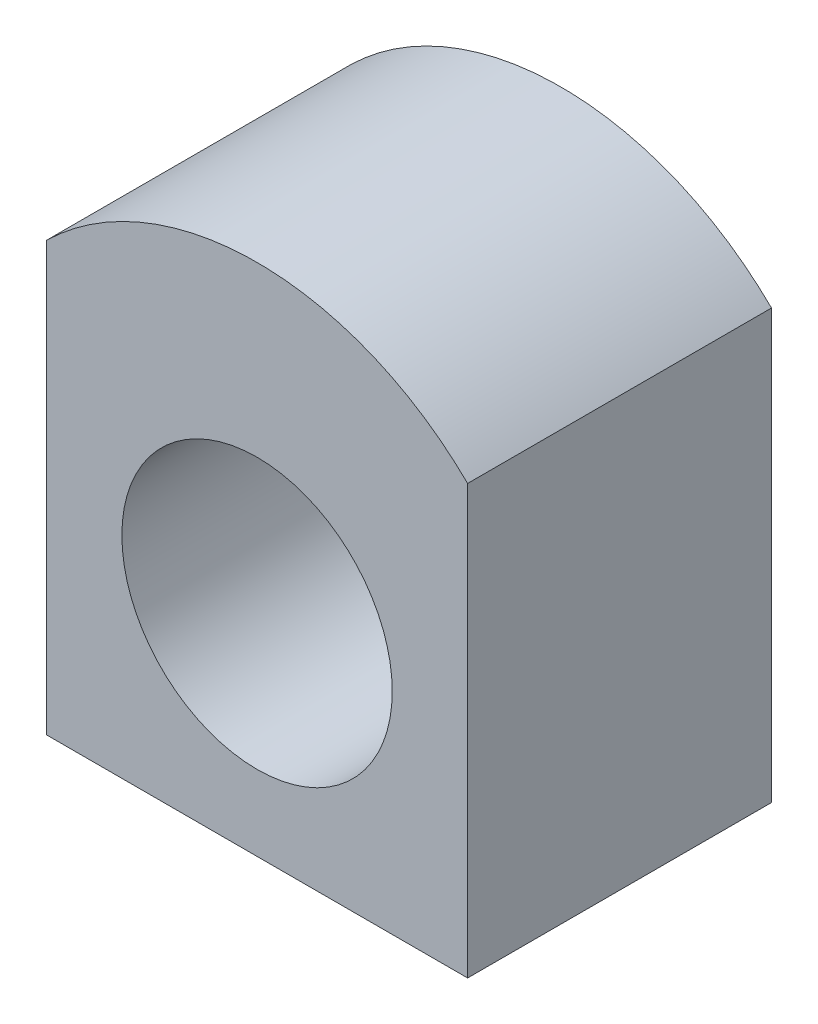
ISO-10303-21;
HEADER;
FILE_DESCRIPTION(('STEP AP214'),'2;1');
FILE_NAME('part.step','',(''),(''),'','','');
FILE_SCHEMA(('AUTOMOTIVE_DESIGN { 1 0 10303 214 1 1 1 1 }'));
ENDSEC;
DATA;
#1=APPLICATION_CONTEXT('core data for automotive mechanical design processes');
#2=APPLICATION_PROTOCOL_DEFINITION('international standard','automotive_design',2000,#1);
#3=PRODUCT_CONTEXT('',#1,'mechanical');
#4=PRODUCT('Part','Part','',(#3));
#5=PRODUCT_RELATED_PRODUCT_CATEGORY('part','',(#4));
#6=PRODUCT_DEFINITION_FORMATION('','',#4);
#7=PRODUCT_DEFINITION_CONTEXT('part definition',#1,'design');
#8=PRODUCT_DEFINITION('design','',#6,#7);
#9=PRODUCT_DEFINITION_SHAPE('','',#8);
#10=(LENGTH_UNIT() NAMED_UNIT(*) SI_UNIT(.MILLI.,.METRE.));
#11=(NAMED_UNIT(*) PLANE_ANGLE_UNIT() SI_UNIT($,.RADIAN.));
#12=(NAMED_UNIT(*) SI_UNIT($,.STERADIAN.) SOLID_ANGLE_UNIT());
#13=UNCERTAINTY_MEASURE_WITH_UNIT(LENGTH_MEASURE(1.E-05),#10,'distance_accuracy_value','');
#14=(GEOMETRIC_REPRESENTATION_CONTEXT(3) GLOBAL_UNCERTAINTY_ASSIGNED_CONTEXT((#13)) GLOBAL_UNIT_ASSIGNED_CONTEXT((#10,
#11,#12)) REPRESENTATION_CONTEXT('',''));
#15=CARTESIAN_POINT('',(0.,0.,0.));
#16=DIRECTION('',(0.,0.,1.));
#17=DIRECTION('',(1.,0.,0.));
#18=AXIS2_PLACEMENT_3D('',#15,#16,#17);
#19=CARTESIAN_POINT('',(-8.8,0.,12.7));
#20=DIRECTION('',(1.,0.,0.));
#21=DIRECTION('',(0.,0.,-1.));
#22=AXIS2_PLACEMENT_3D('',#19,#20,#21);
#23=PLANE('',#22);
#24=DIRECTION('',(0.,-1.,0.));
#25=VECTOR('',#24,1.);
#26=CARTESIAN_POINT('',(-8.8,0.,0.));
#27=LINE('',#26,#25);
#28=CARTESIAN_POINT('',(-8.8,17.9,0.));
#29=VERTEX_POINT('',#28);
#30=CARTESIAN_POINT('',(-8.8,0.,0.));
#31=VERTEX_POINT('',#30);
#32=EDGE_CURVE('E97',#29,#31,#27,.T.);
#33=ORIENTED_EDGE('',*,*,#32,.T.);
#34=DIRECTION('',(0.,0.,-1.));
#35=VECTOR('',#34,1.);
#36=CARTESIAN_POINT('',(-8.8,0.,12.7));
#37=LINE('',#36,#35);
#38=CARTESIAN_POINT('',(-8.8,0.,12.7));
#39=VERTEX_POINT('',#38);
#40=EDGE_CURVE('E11',#39,#31,#37,.T.);
#41=ORIENTED_EDGE('',*,*,#40,.F.);
#42=DIRECTION('',(0.,-1.,0.));
#43=VECTOR('',#42,1.);
#44=CARTESIAN_POINT('',(-8.8,0.,12.7));
#45=LINE('',#44,#43);
#46=CARTESIAN_POINT('',(-8.8,17.9,12.7));
#47=VERTEX_POINT('',#46);
#48=EDGE_CURVE('E85',#47,#39,#45,.T.);
#49=ORIENTED_EDGE('',*,*,#48,.F.);
#50=DIRECTION('',(0.,0.,-1.));
#51=VECTOR('',#50,1.);
#52=CARTESIAN_POINT('',(-8.8,17.9,12.7));
#53=LINE('',#52,#51);
#54=EDGE_CURVE('E93',#47,#29,#53,.T.);
#55=ORIENTED_EDGE('',*,*,#54,.T.);
#56=EDGE_LOOP('',(#33,#41,#49,#55));
#57=FACE_BOUND('',#56,.T.);
#58=ADVANCED_FACE('F34',(#57),#23,.F.);
#59=CARTESIAN_POINT('',(-8.8,0.,12.7));
#60=DIRECTION('',(0.,1.,0.));
#61=DIRECTION('',(0.,0.,1.));
#62=AXIS2_PLACEMENT_3D('',#59,#60,#61);
#63=PLANE('',#62);
#64=DIRECTION('',(1.,0.,0.));
#65=VECTOR('',#64,1.);
#66=CARTESIAN_POINT('',(-8.8,0.,0.));
#67=LINE('',#66,#65);
#68=CARTESIAN_POINT('',(8.8,0.,0.));
#69=VERTEX_POINT('',#68);
#70=EDGE_CURVE('E89',#31,#69,#67,.T.);
#71=ORIENTED_EDGE('',*,*,#70,.T.);
#72=DIRECTION('',(0.,0.,-1.));
#73=VECTOR('',#72,1.);
#74=CARTESIAN_POINT('',(8.8,0.,12.7));
#75=LINE('',#74,#73);
#76=CARTESIAN_POINT('',(8.8,0.,12.7));
#77=VERTEX_POINT('',#76);
#78=EDGE_CURVE('E42',#77,#69,#75,.T.);
#79=ORIENTED_EDGE('',*,*,#78,.F.);
#80=DIRECTION('',(1.,0.,0.));
#81=VECTOR('',#80,1.);
#82=CARTESIAN_POINT('',(-8.8,0.,12.7));
#83=LINE('',#82,#81);
#84=EDGE_CURVE('E80',#39,#77,#83,.T.);
#85=ORIENTED_EDGE('',*,*,#84,.F.);
#86=ORIENTED_EDGE('',*,*,#40,.T.);
#87=EDGE_LOOP('',(#71,#79,#85,#86));
#88=FACE_BOUND('',#87,.T.);
#89=ADVANCED_FACE('F88',(#88),#63,.F.);
#90=CARTESIAN_POINT('',(8.8,0.,12.7));
#91=DIRECTION('',(-1.,0.,0.));
#92=DIRECTION('',(0.,0.,1.));
#93=AXIS2_PLACEMENT_3D('',#90,#91,#92);
#94=PLANE('',#93);
#95=DIRECTION('',(0.,1.,0.));
#96=VECTOR('',#95,1.);
#97=CARTESIAN_POINT('',(8.8,0.,0.));
#98=LINE('',#97,#96);
#99=CARTESIAN_POINT('',(8.8,17.9,0.));
#100=VERTEX_POINT('',#99);
#101=EDGE_CURVE('E67',#69,#100,#98,.T.);
#102=ORIENTED_EDGE('',*,*,#101,.T.);
#103=DIRECTION('',(0.,0.,-1.));
#104=VECTOR('',#103,1.);
#105=CARTESIAN_POINT('',(8.8,17.9,12.7));
#106=LINE('',#105,#104);
#107=CARTESIAN_POINT('',(8.8,17.9,12.7));
#108=VERTEX_POINT('',#107);
#109=EDGE_CURVE('E90',#108,#100,#106,.T.);
#110=ORIENTED_EDGE('',*,*,#109,.F.);
#111=DIRECTION('',(0.,1.,0.));
#112=VECTOR('',#111,1.);
#113=CARTESIAN_POINT('',(8.8,0.,12.7));
#114=LINE('',#113,#112);
#115=EDGE_CURVE('E83',#77,#108,#114,.T.);
#116=ORIENTED_EDGE('',*,*,#115,.F.);
#117=ORIENTED_EDGE('',*,*,#78,.T.);
#118=EDGE_LOOP('',(#102,#110,#116,#117));
#119=FACE_BOUND('',#118,.T.);
#120=ADVANCED_FACE('F91',(#119),#94,.F.);
#121=CARTESIAN_POINT('',(0.,8.94444444444444,12.7));
#122=DIRECTION('',(0.,0.,-1.));
#123=DIRECTION('',(-1.,0.,0.));
#124=AXIS2_PLACEMENT_3D('',#121,#122,#123);
#125=CYLINDRICAL_SURFACE('',#124,12.5555555555556);
#126=CARTESIAN_POINT('',(0.,8.94444444444444,0.));
#127=DIRECTION('',(0.,0.,1.));
#128=DIRECTION('',(-1.,0.,0.));
#129=AXIS2_PLACEMENT_3D('',#126,#127,#128);
#130=CIRCLE('',#129,12.5555555555556);
#131=EDGE_CURVE('E73',#100,#29,#130,.T.);
#132=ORIENTED_EDGE('',*,*,#131,.T.);
#133=ORIENTED_EDGE('',*,*,#54,.F.);
#134=CARTESIAN_POINT('',(0.,8.94444444444444,12.7));
#135=DIRECTION('',(0.,0.,1.));
#136=DIRECTION('',(-1.,0.,0.));
#137=AXIS2_PLACEMENT_3D('',#134,#135,#136);
#138=CIRCLE('',#137,12.5555555555556);
#139=EDGE_CURVE('E50',#108,#47,#138,.T.);
#140=ORIENTED_EDGE('',*,*,#139,.F.);
#141=ORIENTED_EDGE('',*,*,#109,.T.);
#142=EDGE_LOOP('',(#132,#133,#140,#141));
#143=FACE_BOUND('',#142,.T.);
#144=ADVANCED_FACE('F105',(#143),#125,.T.);
#145=CARTESIAN_POINT('',(0.,8.94444444444444,12.7));
#146=DIRECTION('',(0.,0.,-1.));
#147=DIRECTION('',(-1.,0.,0.));
#148=AXIS2_PLACEMENT_3D('',#145,#146,#147);
#149=PLANE('',#148);
#150=CARTESIAN_POINT('',(0.,8.8,12.7));
#151=DIRECTION('',(0.,0.,1.));
#152=DIRECTION('',(1.,0.,0.));
#153=AXIS2_PLACEMENT_3D('',#150,#151,#152);
#154=CIRCLE('',#153,5.65);
#155=CARTESIAN_POINT('',(5.65,8.8,12.7));
#156=VERTEX_POINT('',#155);
#157=EDGE_CURVE('E111',#156,#156,#154,.T.);
#158=ORIENTED_EDGE('',*,*,#157,.F.);
#159=EDGE_LOOP('',(#158));
#160=FACE_BOUND('',#159,.T.);
#161=ORIENTED_EDGE('',*,*,#48,.T.);
#162=ORIENTED_EDGE('',*,*,#84,.T.);
#163=ORIENTED_EDGE('',*,*,#115,.T.);
#164=ORIENTED_EDGE('',*,*,#139,.T.);
#165=EDGE_LOOP('',(#161,#162,#163,#164));
#166=FACE_BOUND('',#165,.T.);
#167=ADVANCED_FACE('F81',(#160,#166),#149,.F.);
#168=CARTESIAN_POINT('',(0.,8.94444444444444,0.));
#169=DIRECTION('',(0.,0.,-1.));
#170=DIRECTION('',(-1.,0.,0.));
#171=AXIS2_PLACEMENT_3D('',#168,#169,#170);
#172=PLANE('',#171);
#173=CARTESIAN_POINT('',(0.,8.8,0.));
#174=DIRECTION('',(0.,0.,1.));
#175=DIRECTION('',(1.,0.,0.));
#176=AXIS2_PLACEMENT_3D('',#173,#174,#175);
#177=CIRCLE('',#176,5.65);
#178=CARTESIAN_POINT('',(5.65,8.8,0.));
#179=VERTEX_POINT('',#178);
#180=EDGE_CURVE('E100',#179,#179,#177,.T.);
#181=ORIENTED_EDGE('',*,*,#180,.T.);
#182=EDGE_LOOP('',(#181));
#183=FACE_BOUND('',#182,.T.);
#184=ORIENTED_EDGE('',*,*,#32,.F.);
#185=ORIENTED_EDGE('',*,*,#131,.F.);
#186=ORIENTED_EDGE('',*,*,#101,.F.);
#187=ORIENTED_EDGE('',*,*,#70,.F.);
#188=EDGE_LOOP('',(#184,#185,#186,#187));
#189=FACE_BOUND('',#188,.T.);
#190=ADVANCED_FACE('F108',(#183,#189),#172,.T.);
#191=CARTESIAN_POINT('',(0.,8.8,0.));
#192=DIRECTION('',(0.,0.,1.));
#193=DIRECTION('',(1.,0.,0.));
#194=AXIS2_PLACEMENT_3D('',#191,#192,#193);
#195=CYLINDRICAL_SURFACE('',#194,5.65);
#196=ORIENTED_EDGE('',*,*,#180,.F.);
#197=EDGE_LOOP('',(#196));
#198=FACE_BOUND('',#197,.T.);
#199=ORIENTED_EDGE('',*,*,#157,.T.);
#200=EDGE_LOOP('',(#199));
#201=FACE_BOUND('',#200,.T.);
#202=ADVANCED_FACE('F118',(#198,#201),#195,.F.);
#203=CLOSED_SHELL('',(#58,#89,#120,#144,#167,#190,#202));
#204=MANIFOLD_SOLID_BREP('B2',#203);
#205=ADVANCED_BREP_SHAPE_REPRESENTATION('',(#18,#204),#14);
#206=SHAPE_DEFINITION_REPRESENTATION(#9,#205);
ENDSEC;
END-ISO-10303-21;
